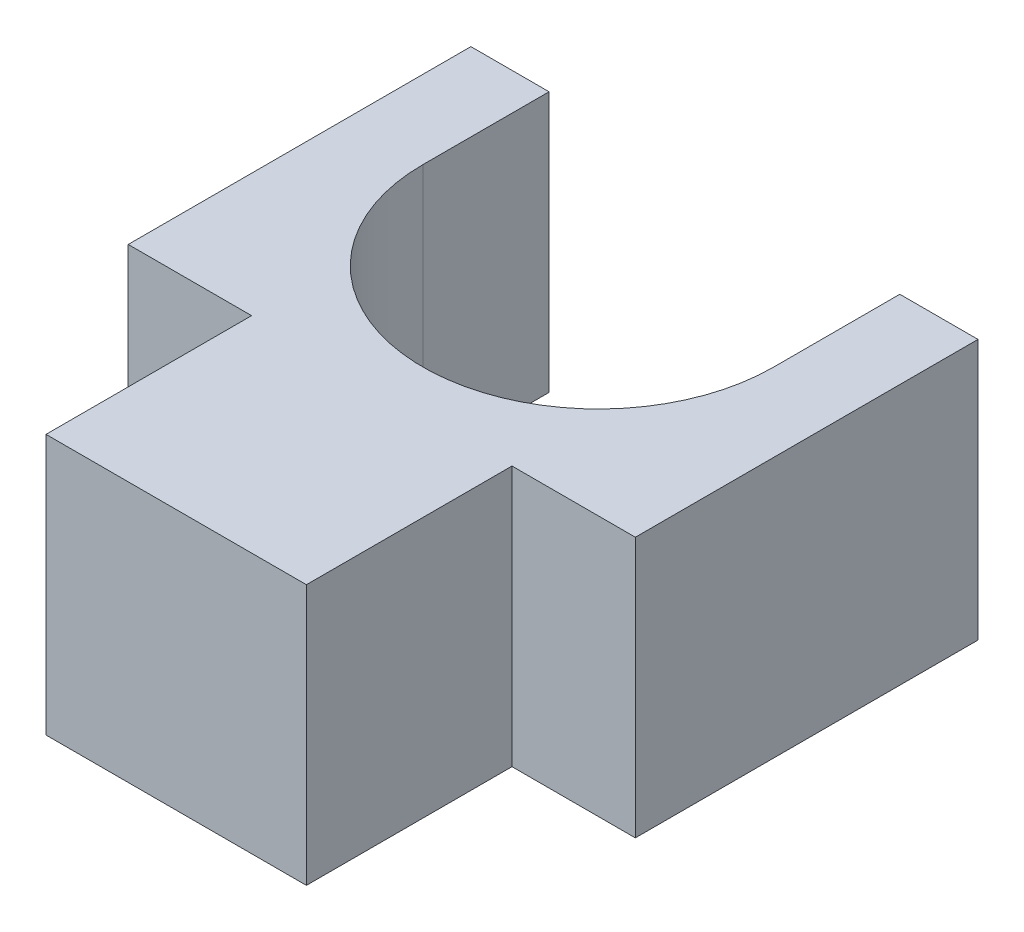
ISO-10303-21;
HEADER;
FILE_DESCRIPTION(('STEP AP214'),'2;1');
FILE_NAME('part.step','',(''),(''),'','','');
FILE_SCHEMA(('AUTOMOTIVE_DESIGN { 1 0 10303 214 1 1 1 1 }'));
ENDSEC;
DATA;
#1=APPLICATION_CONTEXT('core data for automotive mechanical design processes');
#2=APPLICATION_PROTOCOL_DEFINITION('international standard','automotive_design',2000,#1);
#3=PRODUCT_CONTEXT('',#1,'mechanical');
#4=PRODUCT('Part','Part','',(#3));
#5=PRODUCT_RELATED_PRODUCT_CATEGORY('part','',(#4));
#6=PRODUCT_DEFINITION_FORMATION('','',#4);
#7=PRODUCT_DEFINITION_CONTEXT('part definition',#1,'design');
#8=PRODUCT_DEFINITION('design','',#6,#7);
#9=PRODUCT_DEFINITION_SHAPE('','',#8);
#10=(LENGTH_UNIT() NAMED_UNIT(*) SI_UNIT(.MILLI.,.METRE.));
#11=(NAMED_UNIT(*) PLANE_ANGLE_UNIT() SI_UNIT($,.RADIAN.));
#12=(NAMED_UNIT(*) SI_UNIT($,.STERADIAN.) SOLID_ANGLE_UNIT());
#13=UNCERTAINTY_MEASURE_WITH_UNIT(LENGTH_MEASURE(1.E-05),#10,'distance_accuracy_value','');
#14=(GEOMETRIC_REPRESENTATION_CONTEXT(3) GLOBAL_UNCERTAINTY_ASSIGNED_CONTEXT((#13)) GLOBAL_UNIT_ASSIGNED_CONTEXT((#10,
#11,#12)) REPRESENTATION_CONTEXT('',''));
#15=CARTESIAN_POINT('',(0.,0.,0.));
#16=DIRECTION('',(0.,0.,1.));
#17=DIRECTION('',(1.,0.,0.));
#18=AXIS2_PLACEMENT_3D('',#15,#16,#17);
#19=CARTESIAN_POINT('',(1.625,2.413,-5.08));
#20=DIRECTION('',(0.,0.,1.));
#21=DIRECTION('',(1.,0.,0.));
#22=AXIS2_PLACEMENT_3D('',#19,#20,#21);
#23=PLANE('',#22);
#24=DIRECTION('',(-1.,0.,0.));
#25=VECTOR('',#24,1.);
#26=CARTESIAN_POINT('',(1.625,0.,-5.08));
#27=LINE('',#26,#25);
#28=CARTESIAN_POINT('',(2.3495,0.,-5.08));
#29=VERTEX_POINT('',#28);
#30=CARTESIAN_POINT('',(1.625,0.,-5.08));
#31=VERTEX_POINT('',#30);
#32=EDGE_CURVE('E153',#29,#31,#27,.T.);
#33=ORIENTED_EDGE('',*,*,#32,.T.);
#34=DIRECTION('',(0.,-1.,0.));
#35=VECTOR('',#34,1.);
#36=CARTESIAN_POINT('',(1.625,2.413,-5.08));
#37=LINE('',#36,#35);
#38=CARTESIAN_POINT('',(1.625,2.413,-5.08));
#39=VERTEX_POINT('',#38);
#40=EDGE_CURVE('E11',#39,#31,#37,.T.);
#41=ORIENTED_EDGE('',*,*,#40,.F.);
#42=DIRECTION('',(-1.,0.,0.));
#43=VECTOR('',#42,1.);
#44=CARTESIAN_POINT('',(1.625,2.413,-5.08));
#45=LINE('',#44,#43);
#46=CARTESIAN_POINT('',(2.3495,2.413,-5.08));
#47=VERTEX_POINT('',#46);
#48=EDGE_CURVE('E175',#47,#39,#45,.T.);
#49=ORIENTED_EDGE('',*,*,#48,.F.);
#50=DIRECTION('',(0.,-1.,0.));
#51=VECTOR('',#50,1.);
#52=CARTESIAN_POINT('',(2.3495,2.413,-5.08));
#53=LINE('',#52,#51);
#54=EDGE_CURVE('E149',#47,#29,#53,.T.);
#55=ORIENTED_EDGE('',*,*,#54,.T.);
#56=EDGE_LOOP('',(#33,#41,#49,#55));
#57=FACE_BOUND('',#56,.T.);
#58=ADVANCED_FACE('F33',(#57),#23,.F.);
#59=CARTESIAN_POINT('',(1.625,2.413,-3.911));
#60=DIRECTION('',(1.,0.,0.));
#61=DIRECTION('',(0.,0.,-1.));
#62=AXIS2_PLACEMENT_3D('',#59,#60,#61);
#63=PLANE('',#62);
#64=DIRECTION('',(0.,0.,1.));
#65=VECTOR('',#64,1.);
#66=CARTESIAN_POINT('',(1.625,0.,-3.911));
#67=LINE('',#66,#65);
#68=CARTESIAN_POINT('',(1.625,0.,-3.911));
#69=VERTEX_POINT('',#68);
#70=EDGE_CURVE('E156',#31,#69,#67,.T.);
#71=ORIENTED_EDGE('',*,*,#70,.T.);
#72=DIRECTION('',(0.,-1.,0.));
#73=VECTOR('',#72,1.);
#74=CARTESIAN_POINT('',(1.625,2.413,-3.911));
#75=LINE('',#74,#73);
#76=CARTESIAN_POINT('',(1.625,2.413,-3.911));
#77=VERTEX_POINT('',#76);
#78=EDGE_CURVE('E41',#77,#69,#75,.T.);
#79=ORIENTED_EDGE('',*,*,#78,.F.);
#80=DIRECTION('',(0.,0.,1.));
#81=VECTOR('',#80,1.);
#82=CARTESIAN_POINT('',(1.625,2.413,-3.911));
#83=LINE('',#82,#81);
#84=EDGE_CURVE('E104',#39,#77,#83,.T.);
#85=ORIENTED_EDGE('',*,*,#84,.F.);
#86=ORIENTED_EDGE('',*,*,#40,.T.);
#87=EDGE_LOOP('',(#71,#79,#85,#86));
#88=FACE_BOUND('',#87,.T.);
#89=ADVANCED_FACE('F253',(#88),#63,.F.);
#90=CARTESIAN_POINT('',(0.,2.413,-3.911));
#91=DIRECTION('',(0.,-1.,0.));
#92=DIRECTION('',(0.,0.,-1.));
#93=AXIS2_PLACEMENT_3D('',#90,#91,#92);
#94=CYLINDRICAL_SURFACE('',#93,1.625);
#95=CARTESIAN_POINT('',(0.,0.,-3.911));
#96=DIRECTION('',(0.,-1.,0.));
#97=DIRECTION('',(0.,0.,1.));
#98=AXIS2_PLACEMENT_3D('',#95,#96,#97);
#99=CIRCLE('',#98,1.625);
#100=CARTESIAN_POINT('',(-1.625,0.,-3.911));
#101=VERTEX_POINT('',#100);
#102=EDGE_CURVE('E158',#69,#101,#99,.T.);
#103=ORIENTED_EDGE('',*,*,#102,.T.);
#104=DIRECTION('',(0.,-1.,0.));
#105=VECTOR('',#104,1.);
#106=CARTESIAN_POINT('',(-1.625,2.413,-3.911));
#107=LINE('',#106,#105);
#108=CARTESIAN_POINT('',(-1.625,2.413,-3.911));
#109=VERTEX_POINT('',#108);
#110=EDGE_CURVE('E194',#109,#101,#107,.T.);
#111=ORIENTED_EDGE('',*,*,#110,.F.);
#112=CARTESIAN_POINT('',(0.,2.413,-3.911));
#113=DIRECTION('',(0.,-1.,0.));
#114=DIRECTION('',(0.,0.,1.));
#115=AXIS2_PLACEMENT_3D('',#112,#113,#114);
#116=CIRCLE('',#115,1.625);
#117=EDGE_CURVE('E202',#77,#109,#116,.T.);
#118=ORIENTED_EDGE('',*,*,#117,.F.);
#119=ORIENTED_EDGE('',*,*,#78,.T.);
#120=EDGE_LOOP('',(#103,#111,#118,#119));
#121=FACE_BOUND('',#120,.T.);
#122=ADVANCED_FACE('F200',(#121),#94,.F.);
#123=CARTESIAN_POINT('',(-1.625,2.413,-5.08));
#124=DIRECTION('',(-1.,0.,0.));
#125=DIRECTION('',(0.,0.,1.));
#126=AXIS2_PLACEMENT_3D('',#123,#124,#125);
#127=PLANE('',#126);
#128=DIRECTION('',(0.,0.,-1.));
#129=VECTOR('',#128,1.);
#130=CARTESIAN_POINT('',(-1.625,0.,-5.08));
#131=LINE('',#130,#129);
#132=CARTESIAN_POINT('',(-1.625,0.,-5.08));
#133=VERTEX_POINT('',#132);
#134=EDGE_CURVE('E160',#101,#133,#131,.T.);
#135=ORIENTED_EDGE('',*,*,#134,.T.);
#136=DIRECTION('',(0.,-1.,0.));
#137=VECTOR('',#136,1.);
#138=CARTESIAN_POINT('',(-1.625,2.413,-5.08));
#139=LINE('',#138,#137);
#140=CARTESIAN_POINT('',(-1.625,2.413,-5.08));
#141=VERTEX_POINT('',#140);
#142=EDGE_CURVE('E191',#141,#133,#139,.T.);
#143=ORIENTED_EDGE('',*,*,#142,.F.);
#144=DIRECTION('',(0.,0.,-1.));
#145=VECTOR('',#144,1.);
#146=CARTESIAN_POINT('',(-1.625,2.413,-5.08));
#147=LINE('',#146,#145);
#148=EDGE_CURVE('E220',#109,#141,#147,.T.);
#149=ORIENTED_EDGE('',*,*,#148,.F.);
#150=ORIENTED_EDGE('',*,*,#110,.T.);
#151=EDGE_LOOP('',(#135,#143,#149,#150));
#152=FACE_BOUND('',#151,.T.);
#153=ADVANCED_FACE('F211',(#152),#127,.F.);
#154=CARTESIAN_POINT('',(-2.3495,2.413,-5.08));
#155=DIRECTION('',(0.,0.,1.));
#156=DIRECTION('',(1.,0.,0.));
#157=AXIS2_PLACEMENT_3D('',#154,#155,#156);
#158=PLANE('',#157);
#159=DIRECTION('',(-1.,0.,0.));
#160=VECTOR('',#159,1.);
#161=CARTESIAN_POINT('',(-2.3495,0.,-5.08));
#162=LINE('',#161,#160);
#163=CARTESIAN_POINT('',(-2.3495,0.,-5.08));
#164=VERTEX_POINT('',#163);
#165=EDGE_CURVE('E162',#133,#164,#162,.T.);
#166=ORIENTED_EDGE('',*,*,#165,.T.);
#167=DIRECTION('',(0.,-1.,0.));
#168=VECTOR('',#167,1.);
#169=CARTESIAN_POINT('',(-2.3495,2.413,-5.08));
#170=LINE('',#169,#168);
#171=CARTESIAN_POINT('',(-2.3495,2.413,-5.08));
#172=VERTEX_POINT('',#171);
#173=EDGE_CURVE('E188',#172,#164,#170,.T.);
#174=ORIENTED_EDGE('',*,*,#173,.F.);
#175=DIRECTION('',(-1.,0.,0.));
#176=VECTOR('',#175,1.);
#177=CARTESIAN_POINT('',(-2.3495,2.413,-5.08));
#178=LINE('',#177,#176);
#179=EDGE_CURVE('E217',#141,#172,#178,.T.);
#180=ORIENTED_EDGE('',*,*,#179,.F.);
#181=ORIENTED_EDGE('',*,*,#142,.T.);
#182=EDGE_LOOP('',(#166,#174,#180,#181));
#183=FACE_BOUND('',#182,.T.);
#184=ADVANCED_FACE('F215',(#183),#158,.F.);
#185=CARTESIAN_POINT('',(-2.3495,2.413,-1.905));
#186=DIRECTION('',(1.,0.,0.));
#187=DIRECTION('',(0.,0.,-1.));
#188=AXIS2_PLACEMENT_3D('',#185,#186,#187);
#189=PLANE('',#188);
#190=DIRECTION('',(0.,0.,1.));
#191=VECTOR('',#190,1.);
#192=CARTESIAN_POINT('',(-2.3495,0.,-1.905));
#193=LINE('',#192,#191);
#194=CARTESIAN_POINT('',(-2.3495,0.,-1.905));
#195=VERTEX_POINT('',#194);
#196=EDGE_CURVE('E164',#164,#195,#193,.T.);
#197=ORIENTED_EDGE('',*,*,#196,.T.);
#198=DIRECTION('',(0.,-1.,0.));
#199=VECTOR('',#198,1.);
#200=CARTESIAN_POINT('',(-2.3495,2.413,-1.905));
#201=LINE('',#200,#199);
#202=CARTESIAN_POINT('',(-2.3495,2.413,-1.905));
#203=VERTEX_POINT('',#202);
#204=EDGE_CURVE('E185',#203,#195,#201,.T.);
#205=ORIENTED_EDGE('',*,*,#204,.F.);
#206=DIRECTION('',(0.,0.,1.));
#207=VECTOR('',#206,1.);
#208=CARTESIAN_POINT('',(-2.3495,2.413,-1.905));
#209=LINE('',#208,#207);
#210=EDGE_CURVE('E219',#172,#203,#209,.T.);
#211=ORIENTED_EDGE('',*,*,#210,.F.);
#212=ORIENTED_EDGE('',*,*,#173,.T.);
#213=EDGE_LOOP('',(#197,#205,#211,#212));
#214=FACE_BOUND('',#213,.T.);
#215=ADVANCED_FACE('F266',(#214),#189,.F.);
#216=CARTESIAN_POINT('',(-1.2065,2.413,-1.905));
#217=DIRECTION('',(0.,0.,-1.));
#218=DIRECTION('',(-1.,0.,0.));
#219=AXIS2_PLACEMENT_3D('',#216,#217,#218);
#220=PLANE('',#219);
#221=DIRECTION('',(1.,0.,0.));
#222=VECTOR('',#221,1.);
#223=CARTESIAN_POINT('',(-1.2065,0.,-1.905));
#224=LINE('',#223,#222);
#225=CARTESIAN_POINT('',(-1.2065,0.,-1.905));
#226=VERTEX_POINT('',#225);
#227=EDGE_CURVE('E166',#195,#226,#224,.T.);
#228=ORIENTED_EDGE('',*,*,#227,.T.);
#229=DIRECTION('',(0.,-1.,0.));
#230=VECTOR('',#229,1.);
#231=CARTESIAN_POINT('',(-1.2065,2.413,-1.905));
#232=LINE('',#231,#230);
#233=CARTESIAN_POINT('',(-1.2065,2.413,-1.905));
#234=VERTEX_POINT('',#233);
#235=EDGE_CURVE('E182',#234,#226,#232,.T.);
#236=ORIENTED_EDGE('',*,*,#235,.F.);
#237=DIRECTION('',(1.,0.,0.));
#238=VECTOR('',#237,1.);
#239=CARTESIAN_POINT('',(-1.2065,2.413,-1.905));
#240=LINE('',#239,#238);
#241=EDGE_CURVE('E222',#203,#234,#240,.T.);
#242=ORIENTED_EDGE('',*,*,#241,.F.);
#243=ORIENTED_EDGE('',*,*,#204,.T.);
#244=EDGE_LOOP('',(#228,#236,#242,#243));
#245=FACE_BOUND('',#244,.T.);
#246=ADVANCED_FACE('F269',(#245),#220,.F.);
#247=CARTESIAN_POINT('',(-1.2065,2.413,0.));
#248=DIRECTION('',(1.,0.,0.));
#249=DIRECTION('',(0.,0.,-1.));
#250=AXIS2_PLACEMENT_3D('',#247,#248,#249);
#251=PLANE('',#250);
#252=DIRECTION('',(0.,0.,1.));
#253=VECTOR('',#252,1.);
#254=CARTESIAN_POINT('',(-1.2065,0.,0.));
#255=LINE('',#254,#253);
#256=CARTESIAN_POINT('',(-1.2065,0.,0.));
#257=VERTEX_POINT('',#256);
#258=EDGE_CURVE('E168',#226,#257,#255,.T.);
#259=ORIENTED_EDGE('',*,*,#258,.T.);
#260=DIRECTION('',(0.,-1.,0.));
#261=VECTOR('',#260,1.);
#262=CARTESIAN_POINT('',(-1.2065,2.413,0.));
#263=LINE('',#262,#261);
#264=CARTESIAN_POINT('',(-1.2065,2.413,0.));
#265=VERTEX_POINT('',#264);
#266=EDGE_CURVE('E179',#265,#257,#263,.T.);
#267=ORIENTED_EDGE('',*,*,#266,.F.);
#268=DIRECTION('',(0.,0.,1.));
#269=VECTOR('',#268,1.);
#270=CARTESIAN_POINT('',(-1.2065,2.413,0.));
#271=LINE('',#270,#269);
#272=EDGE_CURVE('E228',#234,#265,#271,.T.);
#273=ORIENTED_EDGE('',*,*,#272,.F.);
#274=ORIENTED_EDGE('',*,*,#235,.T.);
#275=EDGE_LOOP('',(#259,#267,#273,#274));
#276=FACE_BOUND('',#275,.T.);
#277=ADVANCED_FACE('F234',(#276),#251,.F.);
#278=CARTESIAN_POINT('',(1.2065,2.413,0.));
#279=DIRECTION('',(0.,0.,-1.));
#280=DIRECTION('',(-1.,0.,0.));
#281=AXIS2_PLACEMENT_3D('',#278,#279,#280);
#282=PLANE('',#281);
#283=DIRECTION('',(1.,0.,0.));
#284=VECTOR('',#283,1.);
#285=CARTESIAN_POINT('',(1.2065,0.,0.));
#286=LINE('',#285,#284);
#287=CARTESIAN_POINT('',(1.2065,0.,0.));
#288=VERTEX_POINT('',#287);
#289=EDGE_CURVE('E170',#257,#288,#286,.T.);
#290=ORIENTED_EDGE('',*,*,#289,.T.);
#291=DIRECTION('',(0.,-1.,0.));
#292=VECTOR('',#291,1.);
#293=CARTESIAN_POINT('',(1.2065,2.413,0.));
#294=LINE('',#293,#292);
#295=CARTESIAN_POINT('',(1.2065,2.413,0.));
#296=VERTEX_POINT('',#295);
#297=EDGE_CURVE('E144',#296,#288,#294,.T.);
#298=ORIENTED_EDGE('',*,*,#297,.F.);
#299=DIRECTION('',(1.,0.,0.));
#300=VECTOR('',#299,1.);
#301=CARTESIAN_POINT('',(1.2065,2.413,0.));
#302=LINE('',#301,#300);
#303=EDGE_CURVE('E135',#265,#296,#302,.T.);
#304=ORIENTED_EDGE('',*,*,#303,.F.);
#305=ORIENTED_EDGE('',*,*,#266,.T.);
#306=EDGE_LOOP('',(#290,#298,#304,#305));
#307=FACE_BOUND('',#306,.T.);
#308=ADVANCED_FACE('F238',(#307),#282,.F.);
#309=CARTESIAN_POINT('',(1.2065,2.413,0.));
#310=DIRECTION('',(-1.,0.,0.));
#311=DIRECTION('',(0.,0.,1.));
#312=AXIS2_PLACEMENT_3D('',#309,#310,#311);
#313=PLANE('',#312);
#314=DIRECTION('',(0.,0.,-1.));
#315=VECTOR('',#314,1.);
#316=CARTESIAN_POINT('',(1.2065,0.,0.));
#317=LINE('',#316,#315);
#318=CARTESIAN_POINT('',(1.2065,0.,-1.905));
#319=VERTEX_POINT('',#318);
#320=EDGE_CURVE('E143',#288,#319,#317,.T.);
#321=ORIENTED_EDGE('',*,*,#320,.T.);
#322=DIRECTION('',(0.,-1.,0.));
#323=VECTOR('',#322,1.);
#324=CARTESIAN_POINT('',(1.2065,2.413,-1.905));
#325=LINE('',#324,#323);
#326=CARTESIAN_POINT('',(1.2065,2.413,-1.905));
#327=VERTEX_POINT('',#326);
#328=EDGE_CURVE('E140',#327,#319,#325,.T.);
#329=ORIENTED_EDGE('',*,*,#328,.F.);
#330=DIRECTION('',(0.,0.,-1.));
#331=VECTOR('',#330,1.);
#332=CARTESIAN_POINT('',(1.2065,2.413,0.));
#333=LINE('',#332,#331);
#334=EDGE_CURVE('E129',#296,#327,#333,.T.);
#335=ORIENTED_EDGE('',*,*,#334,.F.);
#336=ORIENTED_EDGE('',*,*,#297,.T.);
#337=EDGE_LOOP('',(#321,#329,#335,#336));
#338=FACE_BOUND('',#337,.T.);
#339=ADVANCED_FACE('F141',(#338),#313,.F.);
#340=CARTESIAN_POINT('',(2.3495,2.413,-1.905));
#341=DIRECTION('',(0.,0.,-1.));
#342=DIRECTION('',(-1.,0.,0.));
#343=AXIS2_PLACEMENT_3D('',#340,#341,#342);
#344=PLANE('',#343);
#345=DIRECTION('',(1.,0.,0.));
#346=VECTOR('',#345,1.);
#347=CARTESIAN_POINT('',(2.3495,0.,-1.905));
#348=LINE('',#347,#346);
#349=CARTESIAN_POINT('',(2.3495,0.,-1.905));
#350=VERTEX_POINT('',#349);
#351=EDGE_CURVE('E90',#319,#350,#348,.T.);
#352=ORIENTED_EDGE('',*,*,#351,.T.);
#353=DIRECTION('',(0.,-1.,0.));
#354=VECTOR('',#353,1.);
#355=CARTESIAN_POINT('',(2.3495,2.413,-1.905));
#356=LINE('',#355,#354);
#357=CARTESIAN_POINT('',(2.3495,2.413,-1.905));
#358=VERTEX_POINT('',#357);
#359=EDGE_CURVE('E145',#358,#350,#356,.T.);
#360=ORIENTED_EDGE('',*,*,#359,.F.);
#361=DIRECTION('',(1.,0.,0.));
#362=VECTOR('',#361,1.);
#363=CARTESIAN_POINT('',(2.3495,2.413,-1.905));
#364=LINE('',#363,#362);
#365=EDGE_CURVE('E133',#327,#358,#364,.T.);
#366=ORIENTED_EDGE('',*,*,#365,.F.);
#367=ORIENTED_EDGE('',*,*,#328,.T.);
#368=EDGE_LOOP('',(#352,#360,#366,#367));
#369=FACE_BOUND('',#368,.T.);
#370=ADVANCED_FACE('F147',(#369),#344,.F.);
#371=CARTESIAN_POINT('',(2.3495,2.413,-5.08));
#372=DIRECTION('',(-1.,0.,0.));
#373=DIRECTION('',(0.,0.,1.));
#374=AXIS2_PLACEMENT_3D('',#371,#372,#373);
#375=PLANE('',#374);
#376=DIRECTION('',(0.,0.,-1.));
#377=VECTOR('',#376,1.);
#378=CARTESIAN_POINT('',(2.3495,0.,-5.08));
#379=LINE('',#378,#377);
#380=EDGE_CURVE('E96',#350,#29,#379,.T.);
#381=ORIENTED_EDGE('',*,*,#380,.T.);
#382=ORIENTED_EDGE('',*,*,#54,.F.);
#383=DIRECTION('',(0.,0.,-1.));
#384=VECTOR('',#383,1.);
#385=CARTESIAN_POINT('',(2.3495,2.413,-5.08));
#386=LINE('',#385,#384);
#387=EDGE_CURVE('E49',#358,#47,#386,.T.);
#388=ORIENTED_EDGE('',*,*,#387,.F.);
#389=ORIENTED_EDGE('',*,*,#359,.T.);
#390=EDGE_LOOP('',(#381,#382,#388,#389));
#391=FACE_BOUND('',#390,.T.);
#392=ADVANCED_FACE('F242',(#391),#375,.F.);
#393=CARTESIAN_POINT('',(0.,2.413,-3.911));
#394=DIRECTION('',(0.,1.,0.));
#395=DIRECTION('',(0.,0.,1.));
#396=AXIS2_PLACEMENT_3D('',#393,#394,#395);
#397=PLANE('',#396);
#398=ORIENTED_EDGE('',*,*,#48,.T.);
#399=ORIENTED_EDGE('',*,*,#84,.T.);
#400=ORIENTED_EDGE('',*,*,#117,.T.);
#401=ORIENTED_EDGE('',*,*,#148,.T.);
#402=ORIENTED_EDGE('',*,*,#179,.T.);
#403=ORIENTED_EDGE('',*,*,#210,.T.);
#404=ORIENTED_EDGE('',*,*,#241,.T.);
#405=ORIENTED_EDGE('',*,*,#272,.T.);
#406=ORIENTED_EDGE('',*,*,#303,.T.);
#407=ORIENTED_EDGE('',*,*,#334,.T.);
#408=ORIENTED_EDGE('',*,*,#365,.T.);
#409=ORIENTED_EDGE('',*,*,#387,.T.);
#410=EDGE_LOOP('',(#398,#399,#400,#401,#402,#403,#404,#405,#406,#407,#408,#409));
#411=FACE_BOUND('',#410,.T.);
#412=ADVANCED_FACE('F131',(#411),#397,.T.);
#413=CARTESIAN_POINT('',(0.,0.,-3.911));
#414=DIRECTION('',(0.,1.,0.));
#415=DIRECTION('',(0.,0.,1.));
#416=AXIS2_PLACEMENT_3D('',#413,#414,#415);
#417=PLANE('',#416);
#418=ORIENTED_EDGE('',*,*,#32,.F.);
#419=ORIENTED_EDGE('',*,*,#380,.F.);
#420=ORIENTED_EDGE('',*,*,#351,.F.);
#421=ORIENTED_EDGE('',*,*,#320,.F.);
#422=ORIENTED_EDGE('',*,*,#289,.F.);
#423=ORIENTED_EDGE('',*,*,#258,.F.);
#424=ORIENTED_EDGE('',*,*,#227,.F.);
#425=ORIENTED_EDGE('',*,*,#196,.F.);
#426=ORIENTED_EDGE('',*,*,#165,.F.);
#427=ORIENTED_EDGE('',*,*,#134,.F.);
#428=ORIENTED_EDGE('',*,*,#102,.F.);
#429=ORIENTED_EDGE('',*,*,#70,.F.);
#430=EDGE_LOOP('',(#418,#419,#420,#421,#422,#423,#424,#425,#426,#427,#428,#429));
#431=FACE_BOUND('',#430,.T.);
#432=ADVANCED_FACE('F206',(#431),#417,.F.);
#433=CLOSED_SHELL('',(#58,#89,#122,#153,#184,#215,#246,#277,#308,#339,#370,#392,#412,#432));
#434=MANIFOLD_SOLID_BREP('B2',#433);
#435=ADVANCED_BREP_SHAPE_REPRESENTATION('',(#18,#434),#14);
#436=SHAPE_DEFINITION_REPRESENTATION(#9,#435);
ENDSEC;
END-ISO-10303-21;
